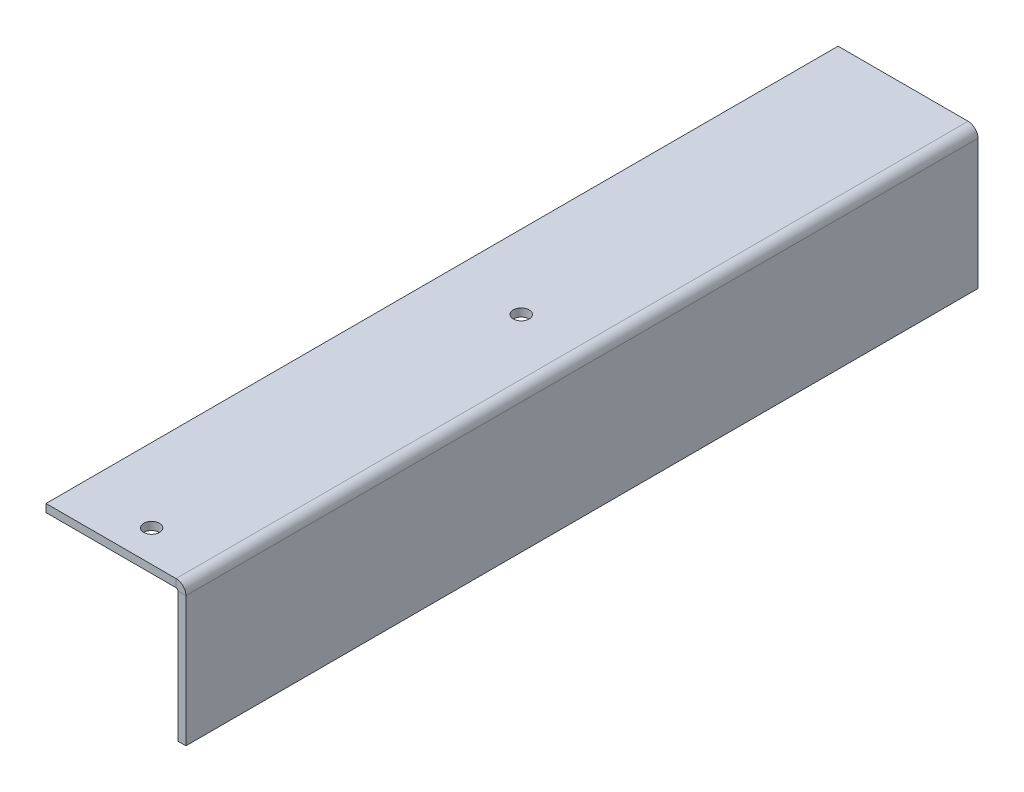
ISO-10303-21;
HEADER;
FILE_DESCRIPTION(('STEP AP214'),'2;1');
FILE_NAME('part.step','',(''),(''),'','','');
FILE_SCHEMA(('AUTOMOTIVE_DESIGN { 1 0 10303 214 1 1 1 1 }'));
ENDSEC;
DATA;
#1=APPLICATION_CONTEXT('core data for automotive mechanical design processes');
#2=APPLICATION_PROTOCOL_DEFINITION('international standard','automotive_design',2000,#1);
#3=PRODUCT_CONTEXT('',#1,'mechanical');
#4=PRODUCT('Part','Part','',(#3));
#5=PRODUCT_RELATED_PRODUCT_CATEGORY('part','',(#4));
#6=PRODUCT_DEFINITION_FORMATION('','',#4);
#7=PRODUCT_DEFINITION_CONTEXT('part definition',#1,'design');
#8=PRODUCT_DEFINITION('design','',#6,#7);
#9=PRODUCT_DEFINITION_SHAPE('','',#8);
#10=(LENGTH_UNIT() NAMED_UNIT(*) SI_UNIT(.MILLI.,.METRE.));
#11=(NAMED_UNIT(*) PLANE_ANGLE_UNIT() SI_UNIT($,.RADIAN.));
#12=(NAMED_UNIT(*) SI_UNIT($,.STERADIAN.) SOLID_ANGLE_UNIT());
#13=UNCERTAINTY_MEASURE_WITH_UNIT(LENGTH_MEASURE(1.E-05),#10,'distance_accuracy_value','');
#14=(GEOMETRIC_REPRESENTATION_CONTEXT(3) GLOBAL_UNCERTAINTY_ASSIGNED_CONTEXT((#13)) GLOBAL_UNIT_ASSIGNED_CONTEXT((#10,
#11,#12)) REPRESENTATION_CONTEXT('',''));
#15=CARTESIAN_POINT('',(0.,0.,0.));
#16=DIRECTION('',(0.,0.,1.));
#17=DIRECTION('',(1.,0.,0.));
#18=AXIS2_PLACEMENT_3D('',#15,#16,#17);
#19=CARTESIAN_POINT('',(-0.736600000000004,50.,300.));
#20=DIRECTION('',(0.,0.,1.));
#21=DIRECTION('',(1.,0.,0.));
#22=AXIS2_PLACEMENT_3D('',#19,#20,#21);
#23=PLANE('',#22);
#24=DIRECTION('',(0.,1.,0.));
#25=VECTOR('',#24,1.);
#26=CARTESIAN_POINT('',(-0.736600000000004,50.,300.));
#27=LINE('',#26,#25);
#28=CARTESIAN_POINT('',(-0.736600000000004,50.,300.));
#29=VERTEX_POINT('',#28);
#30=CARTESIAN_POINT('',(-0.736600000000004,53.,300.));
#31=VERTEX_POINT('',#30);
#32=EDGE_CURVE('E13',#29,#31,#27,.T.);
#33=ORIENTED_EDGE('',*,*,#32,.F.);
#34=CARTESIAN_POINT('',(-0.736600000000004,49.2634,300.));
#35=DIRECTION('',(0.,0.,-1.));
#36=DIRECTION('',(-1.,0.,0.));
#37=AXIS2_PLACEMENT_3D('',#34,#35,#36);
#38=CIRCLE('',#37,0.7366);
#39=CARTESIAN_POINT('',(0.,49.2634,300.));
#40=VERTEX_POINT('',#39);
#41=EDGE_CURVE('E149',#40,#29,#38,.F.);
#42=ORIENTED_EDGE('',*,*,#41,.F.);
#43=DIRECTION('',(-1.,0.,0.));
#44=VECTOR('',#43,1.);
#45=CARTESIAN_POINT('',(3.,49.2634,300.));
#46=LINE('',#45,#44);
#47=CARTESIAN_POINT('',(3.,49.2634,300.));
#48=VERTEX_POINT('',#47);
#49=EDGE_CURVE('E59',#48,#40,#46,.T.);
#50=ORIENTED_EDGE('',*,*,#49,.F.);
#51=CARTESIAN_POINT('',(-0.736600000000004,49.2634,300.));
#52=DIRECTION('',(0.,0.,1.));
#53=DIRECTION('',(1.,0.,0.));
#54=AXIS2_PLACEMENT_3D('',#51,#52,#53);
#55=CIRCLE('',#54,3.7366);
#56=EDGE_CURVE('E142',#48,#31,#55,.T.);
#57=ORIENTED_EDGE('',*,*,#56,.T.);
#58=EDGE_LOOP('',(#33,#42,#50,#57));
#59=FACE_BOUND('',#58,.T.);
#60=ADVANCED_FACE('F50',(#59),#23,.T.);
#61=CARTESIAN_POINT('',(3.,49.2634,300.));
#62=DIRECTION('',(0.,0.,1.));
#63=DIRECTION('',(1.,0.,0.));
#64=AXIS2_PLACEMENT_3D('',#61,#62,#63);
#65=PLANE('',#64);
#66=DIRECTION('',(-1.,0.,0.));
#67=VECTOR('',#66,1.);
#68=CARTESIAN_POINT('',(0.,50.,300.));
#69=LINE('',#68,#67);
#70=CARTESIAN_POINT('',(-50.,49.9999999999999,300.));
#71=VERTEX_POINT('',#70);
#72=EDGE_CURVE('E207',#29,#71,#69,.T.);
#73=ORIENTED_EDGE('',*,*,#72,.F.);
#74=ORIENTED_EDGE('',*,*,#32,.T.);
#75=DIRECTION('',(-1.,0.,0.));
#76=VECTOR('',#75,1.);
#77=CARTESIAN_POINT('',(0.,53.,300.));
#78=LINE('',#77,#76);
#79=CARTESIAN_POINT('',(-50.,52.9999999999999,300.));
#80=VERTEX_POINT('',#79);
#81=EDGE_CURVE('E108',#31,#80,#78,.T.);
#82=ORIENTED_EDGE('',*,*,#81,.T.);
#83=DIRECTION('',(0.,1.,0.));
#84=VECTOR('',#83,1.);
#85=CARTESIAN_POINT('',(-50.,49.9999999999999,300.));
#86=LINE('',#85,#84);
#87=EDGE_CURVE('E204',#71,#80,#86,.T.);
#88=ORIENTED_EDGE('',*,*,#87,.F.);
#89=EDGE_LOOP('',(#73,#74,#82,#88));
#90=FACE_BOUND('',#89,.T.);
#91=ADVANCED_FACE('F227',(#90),#65,.T.);
#92=CARTESIAN_POINT('',(0.,49.2634,0.));
#93=DIRECTION('',(0.,0.,-1.));
#94=DIRECTION('',(-1.,0.,0.));
#95=AXIS2_PLACEMENT_3D('',#92,#93,#94);
#96=PLANE('',#95);
#97=DIRECTION('',(1.,0.,0.));
#98=VECTOR('',#97,1.);
#99=CARTESIAN_POINT('',(0.,49.2634,0.));
#100=LINE('',#99,#98);
#101=CARTESIAN_POINT('',(0.,49.2634,0.));
#102=VERTEX_POINT('',#101);
#103=CARTESIAN_POINT('',(3.,49.2634,0.));
#104=VERTEX_POINT('',#103);
#105=EDGE_CURVE('E95',#102,#104,#100,.T.);
#106=ORIENTED_EDGE('',*,*,#105,.F.);
#107=CARTESIAN_POINT('',(-0.736600000000004,49.2634,0.));
#108=DIRECTION('',(0.,0.,-1.));
#109=DIRECTION('',(-1.,0.,0.));
#110=AXIS2_PLACEMENT_3D('',#107,#108,#109);
#111=CIRCLE('',#110,0.7366);
#112=CARTESIAN_POINT('',(-0.736600000000004,50.,0.));
#113=VERTEX_POINT('',#112);
#114=EDGE_CURVE('E164',#102,#113,#111,.F.);
#115=ORIENTED_EDGE('',*,*,#114,.T.);
#116=DIRECTION('',(0.,-1.,0.));
#117=VECTOR('',#116,1.);
#118=CARTESIAN_POINT('',(-0.736600000000004,53.,0.));
#119=LINE('',#118,#117);
#120=CARTESIAN_POINT('',(-0.736600000000004,53.,0.));
#121=VERTEX_POINT('',#120);
#122=EDGE_CURVE('E102',#121,#113,#119,.T.);
#123=ORIENTED_EDGE('',*,*,#122,.F.);
#124=CARTESIAN_POINT('',(-0.736600000000004,49.2634,0.));
#125=DIRECTION('',(0.,0.,1.));
#126=DIRECTION('',(1.,0.,0.));
#127=AXIS2_PLACEMENT_3D('',#124,#125,#126);
#128=CIRCLE('',#127,3.7366);
#129=EDGE_CURVE('E171',#104,#121,#128,.T.);
#130=ORIENTED_EDGE('',*,*,#129,.F.);
#131=EDGE_LOOP('',(#106,#115,#123,#130));
#132=FACE_BOUND('',#131,.T.);
#133=ADVANCED_FACE('F225',(#132),#96,.T.);
#134=CARTESIAN_POINT('',(-0.736600000000004,53.,0.));
#135=DIRECTION('',(0.,0.,-1.));
#136=DIRECTION('',(-1.,0.,0.));
#137=AXIS2_PLACEMENT_3D('',#134,#135,#136);
#138=PLANE('',#137);
#139=DIRECTION('',(0.,1.,0.));
#140=VECTOR('',#139,1.);
#141=CARTESIAN_POINT('',(0.,0.,0.));
#142=LINE('',#141,#140);
#143=CARTESIAN_POINT('',(0.,0.,0.));
#144=VERTEX_POINT('',#143);
#145=EDGE_CURVE('E166',#144,#102,#142,.T.);
#146=ORIENTED_EDGE('',*,*,#145,.T.);
#147=ORIENTED_EDGE('',*,*,#105,.T.);
#148=DIRECTION('',(0.,1.,0.));
#149=VECTOR('',#148,1.);
#150=CARTESIAN_POINT('',(3.,0.,0.));
#151=LINE('',#150,#149);
#152=CARTESIAN_POINT('',(3.,0.,0.));
#153=VERTEX_POINT('',#152);
#154=EDGE_CURVE('E169',#153,#104,#151,.T.);
#155=ORIENTED_EDGE('',*,*,#154,.F.);
#156=DIRECTION('',(-1.,0.,0.));
#157=VECTOR('',#156,1.);
#158=CARTESIAN_POINT('',(3.,0.,0.));
#159=LINE('',#158,#157);
#160=EDGE_CURVE('E130',#153,#144,#159,.T.);
#161=ORIENTED_EDGE('',*,*,#160,.T.);
#162=EDGE_LOOP('',(#146,#147,#155,#161));
#163=FACE_BOUND('',#162,.T.);
#164=ADVANCED_FACE('F221',(#163),#138,.T.);
#165=CARTESIAN_POINT('',(0.,53.,300.));
#166=DIRECTION('',(0.,-1.,0.));
#167=DIRECTION('',(1.,0.,0.));
#168=AXIS2_PLACEMENT_3D('',#165,#166,#167);
#169=PLANE('',#168);
#170=CARTESIAN_POINT('',(-22.,52.9999999999999,288.));
#171=DIRECTION('',(0.,1.,0.));
#172=DIRECTION('',(-1.,0.,0.));
#173=AXIS2_PLACEMENT_3D('',#170,#171,#172);
#174=CIRCLE('',#173,3.);
#175=CARTESIAN_POINT('',(-25.,52.9999999999999,288.));
#176=VERTEX_POINT('',#175);
#177=EDGE_CURVE('E191',#176,#176,#174,.T.);
#178=ORIENTED_EDGE('',*,*,#177,.F.);
#179=EDGE_LOOP('',(#178));
#180=FACE_BOUND('',#179,.T.);
#181=CARTESIAN_POINT('',(-22.,52.9999999999999,148.));
#182=DIRECTION('',(0.,1.,0.));
#183=DIRECTION('',(-1.,0.,0.));
#184=AXIS2_PLACEMENT_3D('',#181,#182,#183);
#185=CIRCLE('',#184,3.);
#186=CARTESIAN_POINT('',(-25.,52.9999999999999,148.));
#187=VERTEX_POINT('',#186);
#188=EDGE_CURVE('E196',#187,#187,#185,.T.);
#189=ORIENTED_EDGE('',*,*,#188,.F.);
#190=EDGE_LOOP('',(#189));
#191=FACE_BOUND('',#190,.T.);
#192=DIRECTION('',(-1.,0.,0.));
#193=VECTOR('',#192,1.);
#194=CARTESIAN_POINT('',(0.,53.,0.));
#195=LINE('',#194,#193);
#196=CARTESIAN_POINT('',(-50.,52.9999999999999,0.));
#197=VERTEX_POINT('',#196);
#198=EDGE_CURVE('E155',#121,#197,#195,.T.);
#199=ORIENTED_EDGE('',*,*,#198,.T.);
#200=DIRECTION('',(0.,0.,-1.));
#201=VECTOR('',#200,1.);
#202=CARTESIAN_POINT('',(-50.,52.9999999999999,300.));
#203=LINE('',#202,#201);
#204=EDGE_CURVE('E185',#80,#197,#203,.T.);
#205=ORIENTED_EDGE('',*,*,#204,.F.);
#206=ORIENTED_EDGE('',*,*,#81,.F.);
#207=DIRECTION('',(0.,0.,-1.));
#208=VECTOR('',#207,1.);
#209=CARTESIAN_POINT('',(-0.736600000000004,53.,300.));
#210=LINE('',#209,#208);
#211=EDGE_CURVE('E154',#31,#121,#210,.T.);
#212=ORIENTED_EDGE('',*,*,#211,.T.);
#213=EDGE_LOOP('',(#199,#205,#206,#212));
#214=FACE_BOUND('',#213,.T.);
#215=ADVANCED_FACE('F233',(#180,#191,#214),#169,.F.);
#216=CARTESIAN_POINT('',(-50.,49.9999999999999,300.));
#217=DIRECTION('',(-1.,0.,0.));
#218=DIRECTION('',(0.,0.,1.));
#219=AXIS2_PLACEMENT_3D('',#216,#217,#218);
#220=PLANE('',#219);
#221=DIRECTION('',(0.,1.,0.));
#222=VECTOR('',#221,1.);
#223=CARTESIAN_POINT('',(-50.,49.9999999999999,0.));
#224=LINE('',#223,#222);
#225=CARTESIAN_POINT('',(-50.,49.9999999999999,0.));
#226=VERTEX_POINT('',#225);
#227=EDGE_CURVE('E158',#226,#197,#224,.T.);
#228=ORIENTED_EDGE('',*,*,#227,.F.);
#229=DIRECTION('',(0.,0.,-1.));
#230=VECTOR('',#229,1.);
#231=CARTESIAN_POINT('',(-50.,49.9999999999999,300.));
#232=LINE('',#231,#230);
#233=EDGE_CURVE('E183',#71,#226,#232,.T.);
#234=ORIENTED_EDGE('',*,*,#233,.F.);
#235=ORIENTED_EDGE('',*,*,#87,.T.);
#236=ORIENTED_EDGE('',*,*,#204,.T.);
#237=EDGE_LOOP('',(#228,#234,#235,#236));
#238=FACE_BOUND('',#237,.T.);
#239=ADVANCED_FACE('F264',(#238),#220,.T.);
#240=CARTESIAN_POINT('',(0.,50.,300.));
#241=DIRECTION('',(0.,-1.,0.));
#242=DIRECTION('',(1.,0.,0.));
#243=AXIS2_PLACEMENT_3D('',#240,#241,#242);
#244=PLANE('',#243);
#245=CARTESIAN_POINT('',(-22.,49.9999999999999,288.));
#246=DIRECTION('',(0.,-1.,0.));
#247=DIRECTION('',(1.,0.,0.));
#248=AXIS2_PLACEMENT_3D('',#245,#246,#247);
#249=CIRCLE('',#248,3.);
#250=CARTESIAN_POINT('',(-19.,49.9999999999999,288.));
#251=VERTEX_POINT('',#250);
#252=EDGE_CURVE('E53',#251,#251,#249,.T.);
#253=ORIENTED_EDGE('',*,*,#252,.F.);
#254=EDGE_LOOP('',(#253));
#255=FACE_BOUND('',#254,.T.);
#256=CARTESIAN_POINT('',(-22.,49.9999999999999,148.));
#257=DIRECTION('',(0.,-1.,0.));
#258=DIRECTION('',(1.,0.,0.));
#259=AXIS2_PLACEMENT_3D('',#256,#257,#258);
#260=CIRCLE('',#259,3.);
#261=CARTESIAN_POINT('',(-19.,49.9999999999999,148.));
#262=VERTEX_POINT('',#261);
#263=EDGE_CURVE('E189',#262,#262,#260,.T.);
#264=ORIENTED_EDGE('',*,*,#263,.F.);
#265=EDGE_LOOP('',(#264));
#266=FACE_BOUND('',#265,.T.);
#267=DIRECTION('',(-1.,0.,0.));
#268=VECTOR('',#267,1.);
#269=CARTESIAN_POINT('',(0.,50.,0.));
#270=LINE('',#269,#268);
#271=EDGE_CURVE('E161',#113,#226,#270,.T.);
#272=ORIENTED_EDGE('',*,*,#271,.F.);
#273=DIRECTION('',(0.,0.,-1.));
#274=VECTOR('',#273,1.);
#275=CARTESIAN_POINT('',(-0.736600000000004,50.,300.));
#276=LINE('',#275,#274);
#277=EDGE_CURVE('E180',#29,#113,#276,.T.);
#278=ORIENTED_EDGE('',*,*,#277,.F.);
#279=ORIENTED_EDGE('',*,*,#72,.T.);
#280=ORIENTED_EDGE('',*,*,#233,.T.);
#281=EDGE_LOOP('',(#272,#278,#279,#280));
#282=FACE_BOUND('',#281,.T.);
#283=ADVANCED_FACE('F274',(#255,#266,#282),#244,.T.);
#284=CARTESIAN_POINT('',(-0.736600000000004,49.2634,300.));
#285=DIRECTION('',(0.,0.,-1.));
#286=DIRECTION('',(-1.,0.,0.));
#287=AXIS2_PLACEMENT_3D('',#284,#285,#286);
#288=CYLINDRICAL_SURFACE('',#287,0.7366);
#289=ORIENTED_EDGE('',*,*,#114,.F.);
#290=DIRECTION('',(0.,0.,-1.));
#291=VECTOR('',#290,1.);
#292=CARTESIAN_POINT('',(0.,49.2634,300.));
#293=LINE('',#292,#291);
#294=EDGE_CURVE('E177',#40,#102,#293,.T.);
#295=ORIENTED_EDGE('',*,*,#294,.F.);
#296=ORIENTED_EDGE('',*,*,#41,.T.);
#297=ORIENTED_EDGE('',*,*,#277,.T.);
#298=EDGE_LOOP('',(#289,#295,#296,#297));
#299=FACE_BOUND('',#298,.T.);
#300=ADVANCED_FACE('F214',(#299),#288,.F.);
#301=CARTESIAN_POINT('',(0.,0.,300.));
#302=DIRECTION('',(-1.,0.,0.));
#303=DIRECTION('',(0.,0.,1.));
#304=AXIS2_PLACEMENT_3D('',#301,#302,#303);
#305=PLANE('',#304);
#306=ORIENTED_EDGE('',*,*,#145,.F.);
#307=DIRECTION('',(0.,0.,-1.));
#308=VECTOR('',#307,1.);
#309=CARTESIAN_POINT('',(0.,0.,300.));
#310=LINE('',#309,#308);
#311=CARTESIAN_POINT('',(0.,0.,300.));
#312=VERTEX_POINT('',#311);
#313=EDGE_CURVE('E132',#312,#144,#310,.T.);
#314=ORIENTED_EDGE('',*,*,#313,.F.);
#315=DIRECTION('',(0.,1.,0.));
#316=VECTOR('',#315,1.);
#317=CARTESIAN_POINT('',(0.,0.,300.));
#318=LINE('',#317,#316);
#319=EDGE_CURVE('E147',#312,#40,#318,.T.);
#320=ORIENTED_EDGE('',*,*,#319,.T.);
#321=ORIENTED_EDGE('',*,*,#294,.T.);
#322=EDGE_LOOP('',(#306,#314,#320,#321));
#323=FACE_BOUND('',#322,.T.);
#324=ADVANCED_FACE('F220',(#323),#305,.T.);
#325=CARTESIAN_POINT('',(3.,0.,300.));
#326=DIRECTION('',(0.,-1.,0.));
#327=DIRECTION('',(0.,0.,-1.));
#328=AXIS2_PLACEMENT_3D('',#325,#326,#327);
#329=PLANE('',#328);
#330=ORIENTED_EDGE('',*,*,#160,.F.);
#331=DIRECTION('',(0.,0.,-1.));
#332=VECTOR('',#331,1.);
#333=CARTESIAN_POINT('',(3.,0.,300.));
#334=LINE('',#333,#332);
#335=CARTESIAN_POINT('',(3.,0.,300.));
#336=VERTEX_POINT('',#335);
#337=EDGE_CURVE('E124',#336,#153,#334,.T.);
#338=ORIENTED_EDGE('',*,*,#337,.F.);
#339=DIRECTION('',(-1.,0.,0.));
#340=VECTOR('',#339,1.);
#341=CARTESIAN_POINT('',(3.,0.,300.));
#342=LINE('',#341,#340);
#343=EDGE_CURVE('E128',#336,#312,#342,.T.);
#344=ORIENTED_EDGE('',*,*,#343,.T.);
#345=ORIENTED_EDGE('',*,*,#313,.T.);
#346=EDGE_LOOP('',(#330,#338,#344,#345));
#347=FACE_BOUND('',#346,.T.);
#348=ADVANCED_FACE('F126',(#347),#329,.T.);
#349=CARTESIAN_POINT('',(3.,0.,300.));
#350=DIRECTION('',(-1.,0.,0.));
#351=DIRECTION('',(0.,0.,1.));
#352=AXIS2_PLACEMENT_3D('',#349,#350,#351);
#353=PLANE('',#352);
#354=ORIENTED_EDGE('',*,*,#154,.T.);
#355=DIRECTION('',(0.,0.,-1.));
#356=VECTOR('',#355,1.);
#357=CARTESIAN_POINT('',(3.,49.2634,300.));
#358=LINE('',#357,#356);
#359=EDGE_CURVE('E133',#48,#104,#358,.T.);
#360=ORIENTED_EDGE('',*,*,#359,.F.);
#361=DIRECTION('',(0.,1.,0.));
#362=VECTOR('',#361,1.);
#363=CARTESIAN_POINT('',(3.,0.,300.));
#364=LINE('',#363,#362);
#365=EDGE_CURVE('E137',#336,#48,#364,.T.);
#366=ORIENTED_EDGE('',*,*,#365,.F.);
#367=ORIENTED_EDGE('',*,*,#337,.T.);
#368=EDGE_LOOP('',(#354,#360,#366,#367));
#369=FACE_BOUND('',#368,.T.);
#370=ADVANCED_FACE('F138',(#369),#353,.F.);
#371=CARTESIAN_POINT('',(-0.736600000000004,49.2634,300.));
#372=DIRECTION('',(0.,0.,-1.));
#373=DIRECTION('',(-1.,0.,0.));
#374=AXIS2_PLACEMENT_3D('',#371,#372,#373);
#375=CYLINDRICAL_SURFACE('',#374,3.7366);
#376=ORIENTED_EDGE('',*,*,#129,.T.);
#377=ORIENTED_EDGE('',*,*,#211,.F.);
#378=ORIENTED_EDGE('',*,*,#56,.F.);
#379=ORIENTED_EDGE('',*,*,#359,.T.);
#380=EDGE_LOOP('',(#376,#377,#378,#379));
#381=FACE_BOUND('',#380,.T.);
#382=ADVANCED_FACE('F223',(#381),#375,.T.);
#383=CARTESIAN_POINT('',(-0.736600000000004,49.2634,300.));
#384=DIRECTION('',(0.,0.,-1.));
#385=DIRECTION('',(-1.,0.,0.));
#386=AXIS2_PLACEMENT_3D('',#383,#384,#385);
#387=PLANE('',#386);
#388=ORIENTED_EDGE('',*,*,#365,.T.);
#389=ORIENTED_EDGE('',*,*,#49,.T.);
#390=ORIENTED_EDGE('',*,*,#319,.F.);
#391=ORIENTED_EDGE('',*,*,#343,.F.);
#392=EDGE_LOOP('',(#388,#389,#390,#391));
#393=FACE_BOUND('',#392,.T.);
#394=ADVANCED_FACE('F145',(#393),#387,.F.);
#395=CARTESIAN_POINT('',(-0.736600000000004,49.2634,0.));
#396=DIRECTION('',(0.,0.,-1.));
#397=DIRECTION('',(-1.,0.,0.));
#398=AXIS2_PLACEMENT_3D('',#395,#396,#397);
#399=PLANE('',#398);
#400=ORIENTED_EDGE('',*,*,#198,.F.);
#401=ORIENTED_EDGE('',*,*,#122,.T.);
#402=ORIENTED_EDGE('',*,*,#271,.T.);
#403=ORIENTED_EDGE('',*,*,#227,.T.);
#404=EDGE_LOOP('',(#400,#401,#402,#403));
#405=FACE_BOUND('',#404,.T.);
#406=ADVANCED_FACE('F333',(#405),#399,.T.);
#407=CARTESIAN_POINT('',(-22.,42.9999999999999,148.));
#408=DIRECTION('',(0.,1.,0.));
#409=DIRECTION('',(-1.,0.,0.));
#410=AXIS2_PLACEMENT_3D('',#407,#408,#409);
#411=CYLINDRICAL_SURFACE('',#410,3.);
#412=ORIENTED_EDGE('',*,*,#263,.T.);
#413=EDGE_LOOP('',(#412));
#414=FACE_BOUND('',#413,.T.);
#415=ORIENTED_EDGE('',*,*,#188,.T.);
#416=EDGE_LOOP('',(#415));
#417=FACE_BOUND('',#416,.T.);
#418=ADVANCED_FACE('F341',(#414,#417),#411,.F.);
#419=CARTESIAN_POINT('',(-22.,42.9999999999999,288.));
#420=DIRECTION('',(0.,1.,0.));
#421=DIRECTION('',(-1.,0.,0.));
#422=AXIS2_PLACEMENT_3D('',#419,#420,#421);
#423=CYLINDRICAL_SURFACE('',#422,3.);
#424=ORIENTED_EDGE('',*,*,#252,.T.);
#425=EDGE_LOOP('',(#424));
#426=FACE_BOUND('',#425,.T.);
#427=ORIENTED_EDGE('',*,*,#177,.T.);
#428=EDGE_LOOP('',(#427));
#429=FACE_BOUND('',#428,.T.);
#430=ADVANCED_FACE('F351',(#426,#429),#423,.F.);
#431=CLOSED_SHELL('',(#60,#91,#133,#164,#215,#239,#283,#300,#324,#348,#370,#382,#394,#406,#418,#430));
#432=MANIFOLD_SOLID_BREP('B2',#431);
#433=ADVANCED_BREP_SHAPE_REPRESENTATION('',(#18,#432),#14);
#434=SHAPE_DEFINITION_REPRESENTATION(#9,#433);
ENDSEC;
END-ISO-10303-21;
